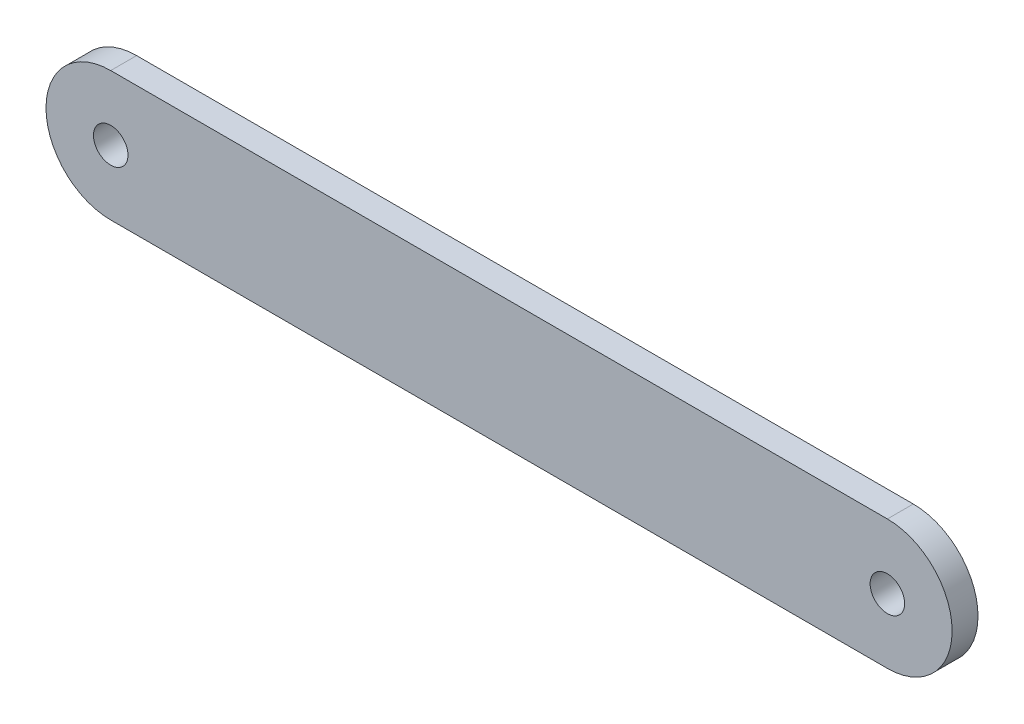
ISO-10303-21;
HEADER;
FILE_DESCRIPTION(('STEP AP214'),'2;1');
FILE_NAME('part.step','',(''),(''),'','','');
FILE_SCHEMA(('AUTOMOTIVE_DESIGN { 1 0 10303 214 1 1 1 1 }'));
ENDSEC;
DATA;
#1=APPLICATION_CONTEXT('core data for automotive mechanical design processes');
#2=APPLICATION_PROTOCOL_DEFINITION('international standard','automotive_design',2000,#1);
#3=PRODUCT_CONTEXT('',#1,'mechanical');
#4=PRODUCT('Part','Part','',(#3));
#5=PRODUCT_RELATED_PRODUCT_CATEGORY('part','',(#4));
#6=PRODUCT_DEFINITION_FORMATION('','',#4);
#7=PRODUCT_DEFINITION_CONTEXT('part definition',#1,'design');
#8=PRODUCT_DEFINITION('design','',#6,#7);
#9=PRODUCT_DEFINITION_SHAPE('','',#8);
#10=(LENGTH_UNIT() NAMED_UNIT(*) SI_UNIT(.MILLI.,.METRE.));
#11=(NAMED_UNIT(*) PLANE_ANGLE_UNIT() SI_UNIT($,.RADIAN.));
#12=(NAMED_UNIT(*) SI_UNIT($,.STERADIAN.) SOLID_ANGLE_UNIT());
#13=UNCERTAINTY_MEASURE_WITH_UNIT(LENGTH_MEASURE(1.E-05),#10,'distance_accuracy_value','');
#14=(GEOMETRIC_REPRESENTATION_CONTEXT(3) GLOBAL_UNCERTAINTY_ASSIGNED_CONTEXT((#13)) GLOBAL_UNIT_ASSIGNED_CONTEXT((#10,
#11,#12)) REPRESENTATION_CONTEXT('',''));
#15=CARTESIAN_POINT('',(0.,0.,0.));
#16=DIRECTION('',(0.,0.,1.));
#17=DIRECTION('',(1.,0.,0.));
#18=AXIS2_PLACEMENT_3D('',#15,#16,#17);
#19=CARTESIAN_POINT('',(0.,0.,3.));
#20=DIRECTION('',(0.,0.,1.));
#21=DIRECTION('',(1.,0.,0.));
#22=AXIS2_PLACEMENT_3D('',#19,#20,#21);
#23=PLANE('',#22);
#24=CARTESIAN_POINT('',(0.,0.,3.));
#25=DIRECTION('',(0.,0.,1.));
#26=DIRECTION('',(1.,0.,0.));
#27=AXIS2_PLACEMENT_3D('',#24,#25,#26);
#28=CIRCLE('',#27,2.);
#29=CARTESIAN_POINT('',(2.,0.,3.));
#30=VERTEX_POINT('',#29);
#31=EDGE_CURVE('E100',#30,#30,#28,.T.);
#32=ORIENTED_EDGE('',*,*,#31,.F.);
#33=EDGE_LOOP('',(#32));
#34=FACE_BOUND('',#33,.T.);
#35=CARTESIAN_POINT('',(0.,0.,3.));
#36=DIRECTION('',(0.,0.,1.));
#37=DIRECTION('',(1.,0.,0.));
#38=AXIS2_PLACEMENT_3D('',#35,#36,#37);
#39=CIRCLE('',#38,7.5);
#40=CARTESIAN_POINT('',(0.,7.5,3.));
#41=VERTEX_POINT('',#40);
#42=CARTESIAN_POINT('',(0.,-7.5,3.));
#43=VERTEX_POINT('',#42);
#44=EDGE_CURVE('E85',#41,#43,#39,.T.);
#45=ORIENTED_EDGE('',*,*,#44,.T.);
#46=DIRECTION('',(1.,0.,0.));
#47=VECTOR('',#46,1.);
#48=CARTESIAN_POINT('',(0.,-7.5,3.));
#49=LINE('',#48,#47);
#50=CARTESIAN_POINT('',(90.,-7.5,3.));
#51=VERTEX_POINT('',#50);
#52=EDGE_CURVE('E80',#43,#51,#49,.T.);
#53=ORIENTED_EDGE('',*,*,#52,.T.);
#54=CARTESIAN_POINT('',(90.,0.,3.));
#55=DIRECTION('',(0.,0.,1.));
#56=DIRECTION('',(1.,0.,0.));
#57=AXIS2_PLACEMENT_3D('',#54,#55,#56);
#58=CIRCLE('',#57,7.5);
#59=CARTESIAN_POINT('',(90.,7.5,3.));
#60=VERTEX_POINT('',#59);
#61=EDGE_CURVE('E83',#51,#60,#58,.T.);
#62=ORIENTED_EDGE('',*,*,#61,.T.);
#63=DIRECTION('',(-1.,0.,0.));
#64=VECTOR('',#63,1.);
#65=CARTESIAN_POINT('',(0.,7.5,3.));
#66=LINE('',#65,#64);
#67=EDGE_CURVE('E50',#60,#41,#66,.T.);
#68=ORIENTED_EDGE('',*,*,#67,.T.);
#69=EDGE_LOOP('',(#45,#53,#62,#68));
#70=FACE_BOUND('',#69,.T.);
#71=CARTESIAN_POINT('',(90.,0.,3.));
#72=DIRECTION('',(0.,0.,1.));
#73=DIRECTION('',(1.,0.,0.));
#74=AXIS2_PLACEMENT_3D('',#71,#72,#73);
#75=CIRCLE('',#74,2.);
#76=CARTESIAN_POINT('',(92.,0.,3.));
#77=VERTEX_POINT('',#76);
#78=EDGE_CURVE('E115',#77,#77,#75,.T.);
#79=ORIENTED_EDGE('',*,*,#78,.F.);
#80=EDGE_LOOP('',(#79));
#81=FACE_BOUND('',#80,.T.);
#82=ADVANCED_FACE('F33',(#34,#70,#81),#23,.T.);
#83=CARTESIAN_POINT('',(0.,0.,0.));
#84=DIRECTION('',(0.,0.,1.));
#85=DIRECTION('',(1.,0.,0.));
#86=AXIS2_PLACEMENT_3D('',#83,#84,#85);
#87=PLANE('',#86);
#88=CARTESIAN_POINT('',(0.,0.,0.));
#89=DIRECTION('',(0.,0.,1.));
#90=DIRECTION('',(1.,0.,0.));
#91=AXIS2_PLACEMENT_3D('',#88,#89,#90);
#92=CIRCLE('',#91,7.5);
#93=CARTESIAN_POINT('',(0.,7.5,0.));
#94=VERTEX_POINT('',#93);
#95=CARTESIAN_POINT('',(0.,-7.5,0.));
#96=VERTEX_POINT('',#95);
#97=EDGE_CURVE('E97',#94,#96,#92,.T.);
#98=ORIENTED_EDGE('',*,*,#97,.F.);
#99=DIRECTION('',(-1.,0.,0.));
#100=VECTOR('',#99,1.);
#101=CARTESIAN_POINT('',(0.,7.5,0.));
#102=LINE('',#101,#100);
#103=CARTESIAN_POINT('',(90.,7.5,0.));
#104=VERTEX_POINT('',#103);
#105=EDGE_CURVE('E73',#104,#94,#102,.T.);
#106=ORIENTED_EDGE('',*,*,#105,.F.);
#107=CARTESIAN_POINT('',(90.,0.,0.));
#108=DIRECTION('',(0.,0.,1.));
#109=DIRECTION('',(1.,0.,0.));
#110=AXIS2_PLACEMENT_3D('',#107,#108,#109);
#111=CIRCLE('',#110,7.5);
#112=CARTESIAN_POINT('',(90.,-7.5,0.));
#113=VERTEX_POINT('',#112);
#114=EDGE_CURVE('E67',#113,#104,#111,.T.);
#115=ORIENTED_EDGE('',*,*,#114,.F.);
#116=DIRECTION('',(1.,0.,0.));
#117=VECTOR('',#116,1.);
#118=CARTESIAN_POINT('',(0.,-7.5,0.));
#119=LINE('',#118,#117);
#120=EDGE_CURVE('E89',#96,#113,#119,.T.);
#121=ORIENTED_EDGE('',*,*,#120,.F.);
#122=EDGE_LOOP('',(#98,#106,#115,#121));
#123=FACE_BOUND('',#122,.T.);
#124=CARTESIAN_POINT('',(0.,0.,0.));
#125=DIRECTION('',(0.,0.,1.));
#126=DIRECTION('',(1.,0.,0.));
#127=AXIS2_PLACEMENT_3D('',#124,#125,#126);
#128=CIRCLE('',#127,2.);
#129=CARTESIAN_POINT('',(2.,0.,0.));
#130=VERTEX_POINT('',#129);
#131=EDGE_CURVE('E112',#130,#130,#128,.T.);
#132=ORIENTED_EDGE('',*,*,#131,.T.);
#133=EDGE_LOOP('',(#132));
#134=FACE_BOUND('',#133,.T.);
#135=CARTESIAN_POINT('',(90.,0.,0.));
#136=DIRECTION('',(0.,0.,1.));
#137=DIRECTION('',(1.,0.,0.));
#138=AXIS2_PLACEMENT_3D('',#135,#136,#137);
#139=CIRCLE('',#138,2.);
#140=CARTESIAN_POINT('',(92.,0.,0.));
#141=VERTEX_POINT('',#140);
#142=EDGE_CURVE('E118',#141,#141,#139,.T.);
#143=ORIENTED_EDGE('',*,*,#142,.T.);
#144=EDGE_LOOP('',(#143));
#145=FACE_BOUND('',#144,.T.);
#146=ADVANCED_FACE('F108',(#123,#134,#145),#87,.F.);
#147=CARTESIAN_POINT('',(0.,0.,3.));
#148=DIRECTION('',(0.,0.,-1.));
#149=DIRECTION('',(-1.,0.,0.));
#150=AXIS2_PLACEMENT_3D('',#147,#148,#149);
#151=CYLINDRICAL_SURFACE('',#150,7.5);
#152=ORIENTED_EDGE('',*,*,#97,.T.);
#153=DIRECTION('',(0.,0.,-1.));
#154=VECTOR('',#153,1.);
#155=CARTESIAN_POINT('',(0.,-7.5,3.));
#156=LINE('',#155,#154);
#157=EDGE_CURVE('E11',#43,#96,#156,.T.);
#158=ORIENTED_EDGE('',*,*,#157,.F.);
#159=ORIENTED_EDGE('',*,*,#44,.F.);
#160=DIRECTION('',(0.,0.,-1.));
#161=VECTOR('',#160,1.);
#162=CARTESIAN_POINT('',(0.,7.5,3.));
#163=LINE('',#162,#161);
#164=EDGE_CURVE('E93',#41,#94,#163,.T.);
#165=ORIENTED_EDGE('',*,*,#164,.T.);
#166=EDGE_LOOP('',(#152,#158,#159,#165));
#167=FACE_BOUND('',#166,.T.);
#168=ADVANCED_FACE('F35',(#167),#151,.T.);
#169=CARTESIAN_POINT('',(0.,-7.5,3.));
#170=DIRECTION('',(0.,1.,0.));
#171=DIRECTION('',(0.,0.,1.));
#172=AXIS2_PLACEMENT_3D('',#169,#170,#171);
#173=PLANE('',#172);
#174=ORIENTED_EDGE('',*,*,#120,.T.);
#175=DIRECTION('',(0.,0.,-1.));
#176=VECTOR('',#175,1.);
#177=CARTESIAN_POINT('',(90.,-7.5,3.));
#178=LINE('',#177,#176);
#179=EDGE_CURVE('E42',#51,#113,#178,.T.);
#180=ORIENTED_EDGE('',*,*,#179,.F.);
#181=ORIENTED_EDGE('',*,*,#52,.F.);
#182=ORIENTED_EDGE('',*,*,#157,.T.);
#183=EDGE_LOOP('',(#174,#180,#181,#182));
#184=FACE_BOUND('',#183,.T.);
#185=ADVANCED_FACE('F88',(#184),#173,.F.);
#186=CARTESIAN_POINT('',(90.,0.,3.));
#187=DIRECTION('',(0.,0.,-1.));
#188=DIRECTION('',(-1.,0.,0.));
#189=AXIS2_PLACEMENT_3D('',#186,#187,#188);
#190=CYLINDRICAL_SURFACE('',#189,7.5);
#191=ORIENTED_EDGE('',*,*,#114,.T.);
#192=DIRECTION('',(0.,0.,-1.));
#193=VECTOR('',#192,1.);
#194=CARTESIAN_POINT('',(90.,7.5,3.));
#195=LINE('',#194,#193);
#196=EDGE_CURVE('E90',#60,#104,#195,.T.);
#197=ORIENTED_EDGE('',*,*,#196,.F.);
#198=ORIENTED_EDGE('',*,*,#61,.F.);
#199=ORIENTED_EDGE('',*,*,#179,.T.);
#200=EDGE_LOOP('',(#191,#197,#198,#199));
#201=FACE_BOUND('',#200,.T.);
#202=ADVANCED_FACE('F91',(#201),#190,.T.);
#203=CARTESIAN_POINT('',(0.,7.5,3.));
#204=DIRECTION('',(0.,-1.,0.));
#205=DIRECTION('',(0.,0.,-1.));
#206=AXIS2_PLACEMENT_3D('',#203,#204,#205);
#207=PLANE('',#206);
#208=ORIENTED_EDGE('',*,*,#105,.T.);
#209=ORIENTED_EDGE('',*,*,#164,.F.);
#210=ORIENTED_EDGE('',*,*,#67,.F.);
#211=ORIENTED_EDGE('',*,*,#196,.T.);
#212=EDGE_LOOP('',(#208,#209,#210,#211));
#213=FACE_BOUND('',#212,.T.);
#214=ADVANCED_FACE('F105',(#213),#207,.F.);
#215=CARTESIAN_POINT('',(0.,0.,3.));
#216=DIRECTION('',(0.,0.,-1.));
#217=DIRECTION('',(-1.,0.,0.));
#218=AXIS2_PLACEMENT_3D('',#215,#216,#217);
#219=CYLINDRICAL_SURFACE('',#218,2.);
#220=ORIENTED_EDGE('',*,*,#31,.T.);
#221=EDGE_LOOP('',(#220));
#222=FACE_BOUND('',#221,.T.);
#223=ORIENTED_EDGE('',*,*,#131,.F.);
#224=EDGE_LOOP('',(#223));
#225=FACE_BOUND('',#224,.T.);
#226=ADVANCED_FACE('F135',(#222,#225),#219,.F.);
#227=CARTESIAN_POINT('',(90.,0.,3.));
#228=DIRECTION('',(0.,0.,-1.));
#229=DIRECTION('',(-1.,0.,0.));
#230=AXIS2_PLACEMENT_3D('',#227,#228,#229);
#231=CYLINDRICAL_SURFACE('',#230,2.);
#232=ORIENTED_EDGE('',*,*,#78,.T.);
#233=EDGE_LOOP('',(#232));
#234=FACE_BOUND('',#233,.T.);
#235=ORIENTED_EDGE('',*,*,#142,.F.);
#236=EDGE_LOOP('',(#235));
#237=FACE_BOUND('',#236,.T.);
#238=ADVANCED_FACE('F124',(#234,#237),#231,.F.);
#239=CLOSED_SHELL('',(#82,#146,#168,#185,#202,#214,#226,#238));
#240=MANIFOLD_SOLID_BREP('B2',#239);
#241=ADVANCED_BREP_SHAPE_REPRESENTATION('',(#18,#240),#14);
#242=SHAPE_DEFINITION_REPRESENTATION(#9,#241);
ENDSEC;
END-ISO-10303-21;
